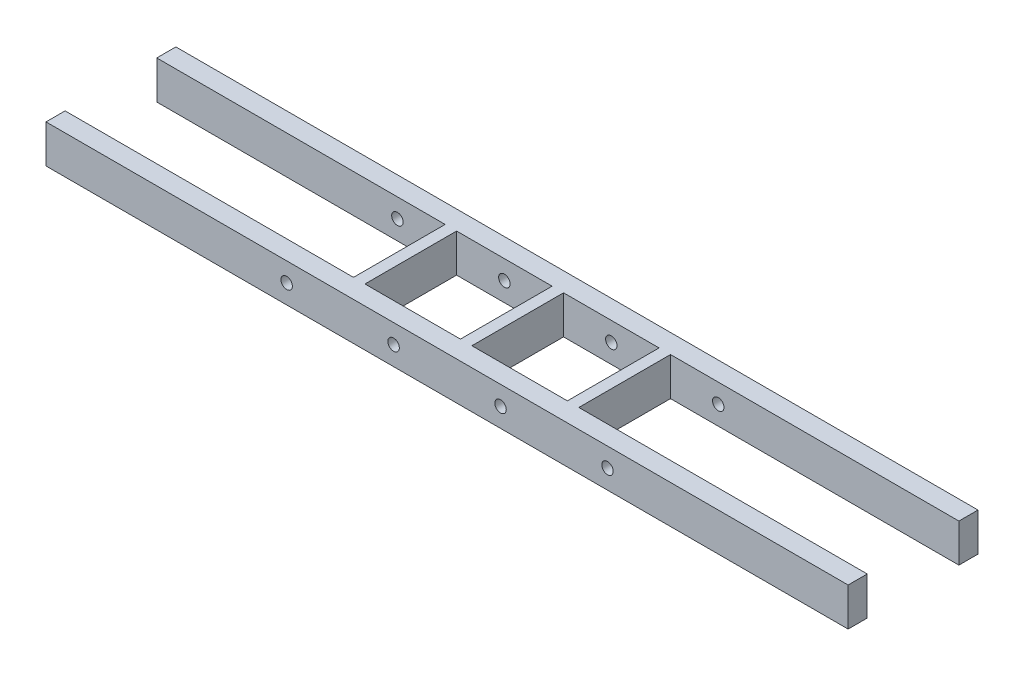
ISO-10303-21;
HEADER;
FILE_DESCRIPTION(('STEP AP214'),'2;1');
FILE_NAME('part.step','',(''),(''),'','','');
FILE_SCHEMA(('AUTOMOTIVE_DESIGN { 1 0 10303 214 1 1 1 1 }'));
ENDSEC;
DATA;
#1=APPLICATION_CONTEXT('core data for automotive mechanical design processes');
#2=APPLICATION_PROTOCOL_DEFINITION('international standard','automotive_design',2000,#1);
#3=PRODUCT_CONTEXT('',#1,'mechanical');
#4=PRODUCT('Part','Part','',(#3));
#5=PRODUCT_RELATED_PRODUCT_CATEGORY('part','',(#4));
#6=PRODUCT_DEFINITION_FORMATION('','',#4);
#7=PRODUCT_DEFINITION_CONTEXT('part definition',#1,'design');
#8=PRODUCT_DEFINITION('design','',#6,#7);
#9=PRODUCT_DEFINITION_SHAPE('','',#8);
#10=(LENGTH_UNIT() NAMED_UNIT(*) SI_UNIT(.MILLI.,.METRE.));
#11=(NAMED_UNIT(*) PLANE_ANGLE_UNIT() SI_UNIT($,.RADIAN.));
#12=(NAMED_UNIT(*) SI_UNIT($,.STERADIAN.) SOLID_ANGLE_UNIT());
#13=UNCERTAINTY_MEASURE_WITH_UNIT(LENGTH_MEASURE(1.E-05),#10,'distance_accuracy_value','');
#14=(GEOMETRIC_REPRESENTATION_CONTEXT(3) GLOBAL_UNCERTAINTY_ASSIGNED_CONTEXT((#13)) GLOBAL_UNIT_ASSIGNED_CONTEXT((#10,
#11,#12)) REPRESENTATION_CONTEXT('',''));
#15=CARTESIAN_POINT('',(0.,0.,0.));
#16=DIRECTION('',(0.,0.,1.));
#17=DIRECTION('',(1.,0.,0.));
#18=AXIS2_PLACEMENT_3D('',#15,#16,#17);
#19=CARTESIAN_POINT('',(0.,0.,5.));
#20=DIRECTION('',(0.,0.,-1.));
#21=DIRECTION('',(-1.,0.,0.));
#22=AXIS2_PLACEMENT_3D('',#19,#20,#21);
#23=PLANE('',#22);
#24=CARTESIAN_POINT('',(42.,0.,5.));
#25=DIRECTION('',(0.,0.,1.));
#26=DIRECTION('',(1.,0.,0.));
#27=AXIS2_PLACEMENT_3D('',#24,#25,#26);
#28=CIRCLE('',#27,1.5);
#29=CARTESIAN_POINT('',(43.5,0.,5.));
#30=VERTEX_POINT('',#29);
#31=EDGE_CURVE('E452',#30,#30,#28,.T.);
#32=ORIENTED_EDGE('',*,*,#31,.F.);
#33=EDGE_LOOP('',(#32));
#34=FACE_BOUND('',#33,.T.);
#35=DIRECTION('',(0.,1.,0.));
#36=VECTOR('',#35,1.);
#37=CARTESIAN_POINT('',(29.5,0.,5.));
#38=LINE('',#37,#36);
#39=CARTESIAN_POINT('',(29.5,-5.,5.));
#40=VERTEX_POINT('',#39);
#41=CARTESIAN_POINT('',(29.5,5.,5.));
#42=VERTEX_POINT('',#41);
#43=EDGE_CURVE('E296',#40,#42,#38,.T.);
#44=ORIENTED_EDGE('',*,*,#43,.F.);
#45=DIRECTION('',(1.,0.,0.));
#46=VECTOR('',#45,1.);
#47=CARTESIAN_POINT('',(-105.,-5.,5.));
#48=LINE('',#47,#46);
#49=CARTESIAN_POINT('',(105.,-5.,5.));
#50=VERTEX_POINT('',#49);
#51=EDGE_CURVE('E488',#40,#50,#48,.T.);
#52=ORIENTED_EDGE('',*,*,#51,.T.);
#53=DIRECTION('',(0.,1.,0.));
#54=VECTOR('',#53,1.);
#55=CARTESIAN_POINT('',(105.,-5.,5.));
#56=LINE('',#55,#54);
#57=CARTESIAN_POINT('',(105.,5.,5.));
#58=VERTEX_POINT('',#57);
#59=EDGE_CURVE('E484',#50,#58,#56,.T.);
#60=ORIENTED_EDGE('',*,*,#59,.T.);
#61=DIRECTION('',(1.,0.,0.));
#62=VECTOR('',#61,1.);
#63=CARTESIAN_POINT('',(-105.,5.,5.));
#64=LINE('',#63,#62);
#65=EDGE_CURVE('E479',#42,#58,#64,.T.);
#66=ORIENTED_EDGE('',*,*,#65,.F.);
#67=EDGE_LOOP('',(#44,#52,#60,#66));
#68=FACE_BOUND('',#67,.T.);
#69=ADVANCED_FACE('F155',(#34,#68),#23,.F.);
#70=CARTESIAN_POINT('',(0.,0.,29.));
#71=DIRECTION('',(0.,0.,-1.));
#72=DIRECTION('',(-1.,0.,0.));
#73=AXIS2_PLACEMENT_3D('',#70,#71,#72);
#74=PLANE('',#73);
#75=CARTESIAN_POINT('',(42.,0.,29.));
#76=DIRECTION('',(0.,0.,1.));
#77=DIRECTION('',(1.,0.,0.));
#78=AXIS2_PLACEMENT_3D('',#75,#76,#77);
#79=CIRCLE('',#78,1.5);
#80=CARTESIAN_POINT('',(43.5,0.,29.));
#81=VERTEX_POINT('',#80);
#82=EDGE_CURVE('E366',#81,#81,#79,.T.);
#83=ORIENTED_EDGE('',*,*,#82,.T.);
#84=EDGE_LOOP('',(#83));
#85=FACE_BOUND('',#84,.T.);
#86=DIRECTION('',(-1.,0.,0.));
#87=VECTOR('',#86,1.);
#88=CARTESIAN_POINT('',(-399918.75,-4.99999999999545,29.));
#89=LINE('',#88,#87);
#90=CARTESIAN_POINT('',(105.000000000018,-4.99999999999545,29.));
#91=VERTEX_POINT('',#90);
#92=CARTESIAN_POINT('',(29.5,-5.,29.));
#93=VERTEX_POINT('',#92);
#94=EDGE_CURVE('E310',#91,#93,#89,.T.);
#95=ORIENTED_EDGE('',*,*,#94,.T.);
#96=DIRECTION('',(0.,-1.,0.));
#97=VECTOR('',#96,1.);
#98=CARTESIAN_POINT('',(29.5,-5.,29.));
#99=LINE('',#98,#97);
#100=CARTESIAN_POINT('',(29.5,5.,29.));
#101=VERTEX_POINT('',#100);
#102=EDGE_CURVE('E293',#101,#93,#99,.T.);
#103=ORIENTED_EDGE('',*,*,#102,.F.);
#104=DIRECTION('',(-1.,0.,0.));
#105=VECTOR('',#104,1.);
#106=CARTESIAN_POINT('',(-399918.75,4.99999999999545,29.));
#107=LINE('',#106,#105);
#108=CARTESIAN_POINT('',(105.000000000018,4.99999999999545,29.));
#109=VERTEX_POINT('',#108);
#110=EDGE_CURVE('E307',#109,#101,#107,.T.);
#111=ORIENTED_EDGE('',*,*,#110,.F.);
#112=DIRECTION('',(0.,-1.,0.));
#113=VECTOR('',#112,1.);
#114=CARTESIAN_POINT('',(105.000000000018,-291594.5,29.));
#115=LINE('',#114,#113);
#116=EDGE_CURVE('E338',#109,#91,#115,.T.);
#117=ORIENTED_EDGE('',*,*,#116,.T.);
#118=EDGE_LOOP('',(#95,#103,#111,#117));
#119=FACE_BOUND('',#118,.T.);
#120=ADVANCED_FACE('F305',(#85,#119),#74,.T.);
#121=CARTESIAN_POINT('',(14.,0.,5.));
#122=DIRECTION('',(0.,0.,1.));
#123=DIRECTION('',(1.,0.,0.));
#124=AXIS2_PLACEMENT_3D('',#121,#122,#123);
#125=CIRCLE('',#124,1.5);
#126=CARTESIAN_POINT('',(15.5,0.,5.));
#127=VERTEX_POINT('',#126);
#128=EDGE_CURVE('E458',#127,#127,#125,.T.);
#129=ORIENTED_EDGE('',*,*,#128,.F.);
#130=EDGE_LOOP('',(#129));
#131=FACE_BOUND('',#130,.T.);
#132=CARTESIAN_POINT('',(1.5,-5.,5.));
#133=VERTEX_POINT('',#132);
#134=CARTESIAN_POINT('',(26.5,-5.,5.));
#135=VERTEX_POINT('',#134);
#136=EDGE_CURVE('E521',#133,#135,#48,.T.);
#137=ORIENTED_EDGE('',*,*,#136,.T.);
#138=DIRECTION('',(0.,1.,0.));
#139=VECTOR('',#138,1.);
#140=CARTESIAN_POINT('',(26.5,0.,5.));
#141=LINE('',#140,#139);
#142=CARTESIAN_POINT('',(26.5,5.,5.));
#143=VERTEX_POINT('',#142);
#144=EDGE_CURVE('E392',#135,#143,#141,.T.);
#145=ORIENTED_EDGE('',*,*,#144,.T.);
#146=CARTESIAN_POINT('',(1.5,5.,5.));
#147=VERTEX_POINT('',#146);
#148=EDGE_CURVE('E539',#147,#143,#64,.T.);
#149=ORIENTED_EDGE('',*,*,#148,.F.);
#150=DIRECTION('',(0.,1.,0.));
#151=VECTOR('',#150,1.);
#152=CARTESIAN_POINT('',(1.5,0.,5.));
#153=LINE('',#152,#151);
#154=EDGE_CURVE('E369',#133,#147,#153,.T.);
#155=ORIENTED_EDGE('',*,*,#154,.F.);
#156=EDGE_LOOP('',(#137,#145,#149,#155));
#157=FACE_BOUND('',#156,.T.);
#158=ADVANCED_FACE('F543',(#131,#157),#23,.F.);
#159=DIRECTION('',(0.,-1.,0.));
#160=VECTOR('',#159,1.);
#161=CARTESIAN_POINT('',(26.5,-5.,29.));
#162=LINE('',#161,#160);
#163=CARTESIAN_POINT('',(26.4999999999986,4.99999999999545,29.));
#164=VERTEX_POINT('',#163);
#165=CARTESIAN_POINT('',(26.5,-5.,29.));
#166=VERTEX_POINT('',#165);
#167=EDGE_CURVE('E172',#164,#166,#162,.T.);
#168=ORIENTED_EDGE('',*,*,#167,.T.);
#169=CARTESIAN_POINT('',(1.50000000002137,-4.99999999999545,29.));
#170=VERTEX_POINT('',#169);
#171=EDGE_CURVE('E334',#166,#170,#89,.T.);
#172=ORIENTED_EDGE('',*,*,#171,.T.);
#173=DIRECTION('',(0.,-1.,0.));
#174=VECTOR('',#173,1.);
#175=CARTESIAN_POINT('',(1.5,-5.,29.));
#176=LINE('',#175,#174);
#177=CARTESIAN_POINT('',(1.50000000002137,4.99999999999545,29.));
#178=VERTEX_POINT('',#177);
#179=EDGE_CURVE('E377',#178,#170,#176,.T.);
#180=ORIENTED_EDGE('',*,*,#179,.F.);
#181=EDGE_CURVE('E317',#164,#178,#107,.T.);
#182=ORIENTED_EDGE('',*,*,#181,.F.);
#183=EDGE_LOOP('',(#168,#172,#180,#182));
#184=FACE_BOUND('',#183,.T.);
#185=CARTESIAN_POINT('',(14.,0.,29.));
#186=DIRECTION('',(0.,0.,1.));
#187=DIRECTION('',(1.,0.,0.));
#188=AXIS2_PLACEMENT_3D('',#185,#186,#187);
#189=CIRCLE('',#188,1.5);
#190=CARTESIAN_POINT('',(15.5,0.,29.));
#191=VERTEX_POINT('',#190);
#192=EDGE_CURVE('E348',#191,#191,#189,.T.);
#193=ORIENTED_EDGE('',*,*,#192,.T.);
#194=EDGE_LOOP('',(#193));
#195=FACE_BOUND('',#194,.T.);
#196=ADVANCED_FACE('F402',(#184,#195),#74,.T.);
#197=CARTESIAN_POINT('',(-14.,0.,5.));
#198=DIRECTION('',(0.,0.,1.));
#199=DIRECTION('',(1.,0.,0.));
#200=AXIS2_PLACEMENT_3D('',#197,#198,#199);
#201=CIRCLE('',#200,1.5);
#202=CARTESIAN_POINT('',(-12.5,0.,5.));
#203=VERTEX_POINT('',#202);
#204=EDGE_CURVE('E464',#203,#203,#201,.T.);
#205=ORIENTED_EDGE('',*,*,#204,.F.);
#206=EDGE_LOOP('',(#205));
#207=FACE_BOUND('',#206,.T.);
#208=CARTESIAN_POINT('',(-26.5,-5.,5.));
#209=VERTEX_POINT('',#208);
#210=CARTESIAN_POINT('',(-1.5,-5.,5.));
#211=VERTEX_POINT('',#210);
#212=EDGE_CURVE('E492',#209,#211,#48,.T.);
#213=ORIENTED_EDGE('',*,*,#212,.T.);
#214=DIRECTION('',(0.,1.,0.));
#215=VECTOR('',#214,1.);
#216=CARTESIAN_POINT('',(-1.5,0.,5.));
#217=LINE('',#216,#215);
#218=CARTESIAN_POINT('',(-1.5,5.,5.));
#219=VERTEX_POINT('',#218);
#220=EDGE_CURVE('E373',#211,#219,#217,.T.);
#221=ORIENTED_EDGE('',*,*,#220,.T.);
#222=CARTESIAN_POINT('',(-26.5,5.,5.));
#223=VERTEX_POINT('',#222);
#224=EDGE_CURVE('E485',#223,#219,#64,.T.);
#225=ORIENTED_EDGE('',*,*,#224,.F.);
#226=DIRECTION('',(0.,1.,0.));
#227=VECTOR('',#226,1.);
#228=CARTESIAN_POINT('',(-26.5,0.,5.));
#229=LINE('',#228,#227);
#230=EDGE_CURVE('E449',#209,#223,#229,.T.);
#231=ORIENTED_EDGE('',*,*,#230,.F.);
#232=EDGE_LOOP('',(#213,#221,#225,#231));
#233=FACE_BOUND('',#232,.T.);
#234=ADVANCED_FACE('F528',(#207,#233),#23,.F.);
#235=CARTESIAN_POINT('',(-105.,-5.,5.));
#236=VERTEX_POINT('',#235);
#237=CARTESIAN_POINT('',(-29.5,-5.,5.));
#238=VERTEX_POINT('',#237);
#239=EDGE_CURVE('E489',#236,#238,#48,.T.);
#240=ORIENTED_EDGE('',*,*,#239,.T.);
#241=DIRECTION('',(0.,1.,0.));
#242=VECTOR('',#241,1.);
#243=CARTESIAN_POINT('',(-29.5,0.,5.));
#244=LINE('',#243,#242);
#245=CARTESIAN_POINT('',(-29.5,5.,5.));
#246=VERTEX_POINT('',#245);
#247=EDGE_CURVE('E446',#238,#246,#244,.T.);
#248=ORIENTED_EDGE('',*,*,#247,.T.);
#249=CARTESIAN_POINT('',(-105.,5.,5.));
#250=VERTEX_POINT('',#249);
#251=EDGE_CURVE('E481',#250,#246,#64,.T.);
#252=ORIENTED_EDGE('',*,*,#251,.F.);
#253=DIRECTION('',(0.,1.,0.));
#254=VECTOR('',#253,1.);
#255=CARTESIAN_POINT('',(-105.,-5.,5.));
#256=LINE('',#255,#254);
#257=EDGE_CURVE('E476',#236,#250,#256,.T.);
#258=ORIENTED_EDGE('',*,*,#257,.F.);
#259=EDGE_LOOP('',(#240,#248,#252,#258));
#260=FACE_BOUND('',#259,.T.);
#261=CARTESIAN_POINT('',(-42.,0.,5.));
#262=DIRECTION('',(0.,0.,1.));
#263=DIRECTION('',(1.,0.,0.));
#264=AXIS2_PLACEMENT_3D('',#261,#262,#263);
#265=CIRCLE('',#264,1.5);
#266=CARTESIAN_POINT('',(-40.5,0.,5.));
#267=VERTEX_POINT('',#266);
#268=EDGE_CURVE('E470',#267,#267,#265,.T.);
#269=ORIENTED_EDGE('',*,*,#268,.F.);
#270=EDGE_LOOP('',(#269));
#271=FACE_BOUND('',#270,.T.);
#272=ADVANCED_FACE('F555',(#260,#271),#23,.F.);
#273=CARTESIAN_POINT('',(0.,0.,0.));
#274=DIRECTION('',(0.,0.,-1.));
#275=DIRECTION('',(-1.,0.,0.));
#276=AXIS2_PLACEMENT_3D('',#273,#274,#275);
#277=PLANE('',#276);
#278=DIRECTION('',(1.,0.,0.));
#279=VECTOR('',#278,1.);
#280=CARTESIAN_POINT('',(-105.,5.,0.));
#281=LINE('',#280,#279);
#282=CARTESIAN_POINT('',(-105.,5.,0.));
#283=VERTEX_POINT('',#282);
#284=CARTESIAN_POINT('',(105.,5.,0.));
#285=VERTEX_POINT('',#284);
#286=EDGE_CURVE('E495',#283,#285,#281,.T.);
#287=ORIENTED_EDGE('',*,*,#286,.T.);
#288=DIRECTION('',(0.,1.,0.));
#289=VECTOR('',#288,1.);
#290=CARTESIAN_POINT('',(105.,-5.,0.));
#291=LINE('',#290,#289);
#292=CARTESIAN_POINT('',(105.,-5.,0.));
#293=VERTEX_POINT('',#292);
#294=EDGE_CURVE('E497',#293,#285,#291,.T.);
#295=ORIENTED_EDGE('',*,*,#294,.F.);
#296=DIRECTION('',(1.,0.,0.));
#297=VECTOR('',#296,1.);
#298=CARTESIAN_POINT('',(-105.,-5.,0.));
#299=LINE('',#298,#297);
#300=CARTESIAN_POINT('',(-105.,-5.,0.));
#301=VERTEX_POINT('',#300);
#302=EDGE_CURVE('E480',#301,#293,#299,.T.);
#303=ORIENTED_EDGE('',*,*,#302,.F.);
#304=DIRECTION('',(0.,1.,0.));
#305=VECTOR('',#304,1.);
#306=CARTESIAN_POINT('',(-105.,-5.,0.));
#307=LINE('',#306,#305);
#308=EDGE_CURVE('E473',#301,#283,#307,.T.);
#309=ORIENTED_EDGE('',*,*,#308,.T.);
#310=EDGE_LOOP('',(#287,#295,#303,#309));
#311=FACE_BOUND('',#310,.T.);
#312=CARTESIAN_POINT('',(-42.,0.,0.));
#313=DIRECTION('',(0.,0.,1.));
#314=DIRECTION('',(1.,0.,0.));
#315=AXIS2_PLACEMENT_3D('',#312,#313,#314);
#316=CIRCLE('',#315,1.5);
#317=CARTESIAN_POINT('',(-40.5,0.,0.));
#318=VERTEX_POINT('',#317);
#319=EDGE_CURVE('E467',#318,#318,#316,.T.);
#320=ORIENTED_EDGE('',*,*,#319,.T.);
#321=EDGE_LOOP('',(#320));
#322=FACE_BOUND('',#321,.T.);
#323=CARTESIAN_POINT('',(-14.,0.,0.));
#324=DIRECTION('',(0.,0.,1.));
#325=DIRECTION('',(1.,0.,0.));
#326=AXIS2_PLACEMENT_3D('',#323,#324,#325);
#327=CIRCLE('',#326,1.5);
#328=CARTESIAN_POINT('',(-12.5,0.,0.));
#329=VERTEX_POINT('',#328);
#330=EDGE_CURVE('E461',#329,#329,#327,.T.);
#331=ORIENTED_EDGE('',*,*,#330,.T.);
#332=EDGE_LOOP('',(#331));
#333=FACE_BOUND('',#332,.T.);
#334=CARTESIAN_POINT('',(14.,0.,0.));
#335=DIRECTION('',(0.,0.,1.));
#336=DIRECTION('',(1.,0.,0.));
#337=AXIS2_PLACEMENT_3D('',#334,#335,#336);
#338=CIRCLE('',#337,1.5);
#339=CARTESIAN_POINT('',(15.5,0.,0.));
#340=VERTEX_POINT('',#339);
#341=EDGE_CURVE('E455',#340,#340,#338,.T.);
#342=ORIENTED_EDGE('',*,*,#341,.T.);
#343=EDGE_LOOP('',(#342));
#344=FACE_BOUND('',#343,.T.);
#345=CARTESIAN_POINT('',(42.,0.,0.));
#346=DIRECTION('',(0.,0.,1.));
#347=DIRECTION('',(1.,0.,0.));
#348=AXIS2_PLACEMENT_3D('',#345,#346,#347);
#349=CIRCLE('',#348,1.5);
#350=CARTESIAN_POINT('',(43.5,0.,0.));
#351=VERTEX_POINT('',#350);
#352=EDGE_CURVE('E451',#351,#351,#349,.T.);
#353=ORIENTED_EDGE('',*,*,#352,.T.);
#354=EDGE_LOOP('',(#353));
#355=FACE_BOUND('',#354,.T.);
#356=ADVANCED_FACE('F513',(#311,#322,#333,#344,#355),#277,.T.);
#357=CARTESIAN_POINT('',(-105.,-5.,5.));
#358=DIRECTION('',(-1.,0.,0.));
#359=DIRECTION('',(0.,0.,1.));
#360=AXIS2_PLACEMENT_3D('',#357,#358,#359);
#361=PLANE('',#360);
#362=ORIENTED_EDGE('',*,*,#308,.F.);
#363=DIRECTION('',(0.,0.,-1.));
#364=VECTOR('',#363,1.);
#365=CARTESIAN_POINT('',(-105.,-5.,5.));
#366=LINE('',#365,#364);
#367=EDGE_CURVE('E12',#236,#301,#366,.T.);
#368=ORIENTED_EDGE('',*,*,#367,.F.);
#369=ORIENTED_EDGE('',*,*,#257,.T.);
#370=DIRECTION('',(0.,0.,-1.));
#371=VECTOR('',#370,1.);
#372=CARTESIAN_POINT('',(-105.,5.,5.));
#373=LINE('',#372,#371);
#374=EDGE_CURVE('E159',#250,#283,#373,.T.);
#375=ORIENTED_EDGE('',*,*,#374,.T.);
#376=EDGE_LOOP('',(#362,#368,#369,#375));
#377=FACE_BOUND('',#376,.T.);
#378=ADVANCED_FACE('F157',(#377),#361,.T.);
#379=CARTESIAN_POINT('',(-105.,-5.,5.));
#380=DIRECTION('',(0.,1.,0.));
#381=DIRECTION('',(0.,0.,1.));
#382=AXIS2_PLACEMENT_3D('',#379,#380,#381);
#383=PLANE('',#382);
#384=ORIENTED_EDGE('',*,*,#51,.F.);
#385=DIRECTION('',(0.,0.,-1.));
#386=VECTOR('',#385,1.);
#387=CARTESIAN_POINT('',(29.5,-5.,39.4403065089106));
#388=LINE('',#387,#386);
#389=EDGE_CURVE('E300',#93,#40,#388,.T.);
#390=ORIENTED_EDGE('',*,*,#389,.F.);
#391=ORIENTED_EDGE('',*,*,#94,.F.);
#392=DIRECTION('',(0.,0.,-1.));
#393=VECTOR('',#392,1.);
#394=CARTESIAN_POINT('',(105.000000000018,-4.99999999999545,34.));
#395=LINE('',#394,#393);
#396=CARTESIAN_POINT('',(105.000000000018,-4.99999999999545,34.));
#397=VERTEX_POINT('',#396);
#398=EDGE_CURVE('E343',#397,#91,#395,.T.);
#399=ORIENTED_EDGE('',*,*,#398,.F.);
#400=DIRECTION('',(-1.,0.,0.));
#401=VECTOR('',#400,1.);
#402=CARTESIAN_POINT('',(-399918.75,-4.99999999999545,34.));
#403=LINE('',#402,#401);
#404=CARTESIAN_POINT('',(-105.000000000018,-4.99999999999545,34.));
#405=VERTEX_POINT('',#404);
#406=EDGE_CURVE('E321',#397,#405,#403,.T.);
#407=ORIENTED_EDGE('',*,*,#406,.T.);
#408=DIRECTION('',(0.,0.,-1.));
#409=VECTOR('',#408,1.);
#410=CARTESIAN_POINT('',(-105.000000000018,-4.99999999999545,34.));
#411=LINE('',#410,#409);
#412=CARTESIAN_POINT('',(-105.000000000018,-4.99999999999545,29.));
#413=VERTEX_POINT('',#412);
#414=EDGE_CURVE('E425',#405,#413,#411,.T.);
#415=ORIENTED_EDGE('',*,*,#414,.T.);
#416=CARTESIAN_POINT('',(-29.4999999999845,-4.99999999999545,29.));
#417=VERTEX_POINT('',#416);
#418=EDGE_CURVE('E336',#417,#413,#89,.T.);
#419=ORIENTED_EDGE('',*,*,#418,.F.);
#420=DIRECTION('',(0.,0.,-1.));
#421=VECTOR('',#420,1.);
#422=CARTESIAN_POINT('',(-29.5,-5.,39.4403065089106));
#423=LINE('',#422,#421);
#424=EDGE_CURVE('E437',#417,#238,#423,.T.);
#425=ORIENTED_EDGE('',*,*,#424,.T.);
#426=ORIENTED_EDGE('',*,*,#239,.F.);
#427=ORIENTED_EDGE('',*,*,#367,.T.);
#428=ORIENTED_EDGE('',*,*,#302,.T.);
#429=DIRECTION('',(0.,0.,-1.));
#430=VECTOR('',#429,1.);
#431=CARTESIAN_POINT('',(105.,-5.,5.));
#432=LINE('',#431,#430);
#433=EDGE_CURVE('E164',#50,#293,#432,.T.);
#434=ORIENTED_EDGE('',*,*,#433,.F.);
#435=EDGE_LOOP('',(#384,#390,#391,#399,#407,#415,#419,#425,#426,#427,#428,#434));
#436=FACE_BOUND('',#435,.T.);
#437=DIRECTION('',(0.,0.,-1.));
#438=VECTOR('',#437,1.);
#439=CARTESIAN_POINT('',(26.5,-5.,39.4403065089106));
#440=LINE('',#439,#438);
#441=EDGE_CURVE('E393',#166,#135,#440,.T.);
#442=ORIENTED_EDGE('',*,*,#441,.T.);
#443=ORIENTED_EDGE('',*,*,#136,.F.);
#444=DIRECTION('',(0.,0.,-1.));
#445=VECTOR('',#444,1.);
#446=CARTESIAN_POINT('',(1.5,-5.,39.4403065089106));
#447=LINE('',#446,#445);
#448=EDGE_CURVE('E380',#170,#133,#447,.T.);
#449=ORIENTED_EDGE('',*,*,#448,.F.);
#450=ORIENTED_EDGE('',*,*,#171,.F.);
#451=EDGE_LOOP('',(#442,#443,#449,#450));
#452=FACE_BOUND('',#451,.T.);
#453=DIRECTION('',(0.,0.,-1.));
#454=VECTOR('',#453,1.);
#455=CARTESIAN_POINT('',(-1.5,-5.,39.4403065089106));
#456=LINE('',#455,#454);
#457=CARTESIAN_POINT('',(-1.50000000002137,-4.99999999999545,29.));
#458=VERTEX_POINT('',#457);
#459=EDGE_CURVE('E376',#458,#211,#456,.T.);
#460=ORIENTED_EDGE('',*,*,#459,.T.);
#461=ORIENTED_EDGE('',*,*,#212,.F.);
#462=DIRECTION('',(0.,0.,-1.));
#463=VECTOR('',#462,1.);
#464=CARTESIAN_POINT('',(-26.5,-5.,39.4403065089106));
#465=LINE('',#464,#463);
#466=CARTESIAN_POINT('',(-26.5,-5.,29.));
#467=VERTEX_POINT('',#466);
#468=EDGE_CURVE('E436',#467,#209,#465,.T.);
#469=ORIENTED_EDGE('',*,*,#468,.F.);
#470=EDGE_CURVE('E411',#458,#467,#89,.T.);
#471=ORIENTED_EDGE('',*,*,#470,.F.);
#472=EDGE_LOOP('',(#460,#461,#469,#471));
#473=FACE_BOUND('',#472,.T.);
#474=ADVANCED_FACE('F407',(#436,#452,#473),#383,.F.);
#475=CARTESIAN_POINT('',(105.,-5.,5.));
#476=DIRECTION('',(-1.,0.,0.));
#477=DIRECTION('',(0.,0.,1.));
#478=AXIS2_PLACEMENT_3D('',#475,#476,#477);
#479=PLANE('',#478);
#480=ORIENTED_EDGE('',*,*,#294,.T.);
#481=DIRECTION('',(0.,0.,-1.));
#482=VECTOR('',#481,1.);
#483=CARTESIAN_POINT('',(105.,5.,5.));
#484=LINE('',#483,#482);
#485=EDGE_CURVE('E502',#58,#285,#484,.T.);
#486=ORIENTED_EDGE('',*,*,#485,.F.);
#487=ORIENTED_EDGE('',*,*,#59,.F.);
#488=ORIENTED_EDGE('',*,*,#433,.T.);
#489=EDGE_LOOP('',(#480,#486,#487,#488));
#490=FACE_BOUND('',#489,.T.);
#491=ADVANCED_FACE('F519',(#490),#479,.F.);
#492=CARTESIAN_POINT('',(-105.,5.,5.));
#493=DIRECTION('',(0.,1.,0.));
#494=DIRECTION('',(0.,0.,1.));
#495=AXIS2_PLACEMENT_3D('',#492,#493,#494);
#496=PLANE('',#495);
#497=DIRECTION('',(0.,0.,-1.));
#498=VECTOR('',#497,1.);
#499=CARTESIAN_POINT('',(29.5,5.,39.4403065089106));
#500=LINE('',#499,#498);
#501=EDGE_CURVE('E290',#101,#42,#500,.T.);
#502=ORIENTED_EDGE('',*,*,#501,.T.);
#503=ORIENTED_EDGE('',*,*,#65,.T.);
#504=ORIENTED_EDGE('',*,*,#485,.T.);
#505=ORIENTED_EDGE('',*,*,#286,.F.);
#506=ORIENTED_EDGE('',*,*,#374,.F.);
#507=ORIENTED_EDGE('',*,*,#251,.T.);
#508=DIRECTION('',(0.,0.,-1.));
#509=VECTOR('',#508,1.);
#510=CARTESIAN_POINT('',(-29.5,5.,39.4403065089106));
#511=LINE('',#510,#509);
#512=CARTESIAN_POINT('',(-29.5,5.,29.));
#513=VERTEX_POINT('',#512);
#514=EDGE_CURVE('E439',#513,#246,#511,.T.);
#515=ORIENTED_EDGE('',*,*,#514,.F.);
#516=CARTESIAN_POINT('',(-105.000000000018,4.99999999999545,29.));
#517=VERTEX_POINT('',#516);
#518=EDGE_CURVE('E319',#513,#517,#107,.T.);
#519=ORIENTED_EDGE('',*,*,#518,.T.);
#520=DIRECTION('',(0.,0.,-1.));
#521=VECTOR('',#520,1.);
#522=CARTESIAN_POINT('',(-105.000000000018,4.99999999999545,34.));
#523=LINE('',#522,#521);
#524=CARTESIAN_POINT('',(-105.000000000018,4.99999999999545,34.));
#525=VERTEX_POINT('',#524);
#526=EDGE_CURVE('E429',#525,#517,#523,.T.);
#527=ORIENTED_EDGE('',*,*,#526,.F.);
#528=DIRECTION('',(-1.,0.,0.));
#529=VECTOR('',#528,1.);
#530=CARTESIAN_POINT('',(-399918.75,4.99999999999545,34.));
#531=LINE('',#530,#529);
#532=CARTESIAN_POINT('',(105.000000000018,4.99999999999545,34.));
#533=VERTEX_POINT('',#532);
#534=EDGE_CURVE('E341',#533,#525,#531,.T.);
#535=ORIENTED_EDGE('',*,*,#534,.F.);
#536=DIRECTION('',(0.,0.,-1.));
#537=VECTOR('',#536,1.);
#538=CARTESIAN_POINT('',(105.000000000018,4.99999999999545,34.));
#539=LINE('',#538,#537);
#540=EDGE_CURVE('E315',#533,#109,#539,.T.);
#541=ORIENTED_EDGE('',*,*,#540,.T.);
#542=ORIENTED_EDGE('',*,*,#110,.T.);
#543=EDGE_LOOP('',(#502,#503,#504,#505,#506,#507,#515,#519,#527,#535,#541,#542));
#544=FACE_BOUND('',#543,.T.);
#545=ORIENTED_EDGE('',*,*,#148,.T.);
#546=DIRECTION('',(0.,0.,-1.));
#547=VECTOR('',#546,1.);
#548=CARTESIAN_POINT('',(26.5,5.,39.4403065089106));
#549=LINE('',#548,#547);
#550=EDGE_CURVE('E176',#164,#143,#549,.T.);
#551=ORIENTED_EDGE('',*,*,#550,.F.);
#552=ORIENTED_EDGE('',*,*,#181,.T.);
#553=DIRECTION('',(0.,0.,-1.));
#554=VECTOR('',#553,1.);
#555=CARTESIAN_POINT('',(1.5,5.,39.4403065089106));
#556=LINE('',#555,#554);
#557=EDGE_CURVE('E386',#178,#147,#556,.T.);
#558=ORIENTED_EDGE('',*,*,#557,.T.);
#559=EDGE_LOOP('',(#545,#551,#552,#558));
#560=FACE_BOUND('',#559,.T.);
#561=ORIENTED_EDGE('',*,*,#224,.T.);
#562=DIRECTION('',(0.,0.,-1.));
#563=VECTOR('',#562,1.);
#564=CARTESIAN_POINT('',(-1.5,5.,39.4403065089106));
#565=LINE('',#564,#563);
#566=CARTESIAN_POINT('',(-1.5,5.,29.));
#567=VERTEX_POINT('',#566);
#568=EDGE_CURVE('E384',#567,#219,#565,.T.);
#569=ORIENTED_EDGE('',*,*,#568,.F.);
#570=CARTESIAN_POINT('',(-26.5,5.,29.));
#571=VERTEX_POINT('',#570);
#572=EDGE_CURVE('E323',#567,#571,#107,.T.);
#573=ORIENTED_EDGE('',*,*,#572,.T.);
#574=DIRECTION('',(0.,0.,-1.));
#575=VECTOR('',#574,1.);
#576=CARTESIAN_POINT('',(-26.5,5.,39.4403065089106));
#577=LINE('',#576,#575);
#578=EDGE_CURVE('E441',#571,#223,#577,.T.);
#579=ORIENTED_EDGE('',*,*,#578,.T.);
#580=EDGE_LOOP('',(#561,#569,#573,#579));
#581=FACE_BOUND('',#580,.T.);
#582=ADVANCED_FACE('F312',(#544,#560,#581),#496,.T.);
#583=CARTESIAN_POINT('',(-42.,0.,5.));
#584=DIRECTION('',(0.,0.,-1.));
#585=DIRECTION('',(-1.,0.,0.));
#586=AXIS2_PLACEMENT_3D('',#583,#584,#585);
#587=CYLINDRICAL_SURFACE('',#586,1.5);
#588=ORIENTED_EDGE('',*,*,#268,.T.);
#589=EDGE_LOOP('',(#588));
#590=FACE_BOUND('',#589,.T.);
#591=ORIENTED_EDGE('',*,*,#319,.F.);
#592=EDGE_LOOP('',(#591));
#593=FACE_BOUND('',#592,.T.);
#594=ADVANCED_FACE('F576',(#590,#593),#587,.F.);
#595=CARTESIAN_POINT('',(-14.,0.,5.));
#596=DIRECTION('',(0.,0.,-1.));
#597=DIRECTION('',(-1.,0.,0.));
#598=AXIS2_PLACEMENT_3D('',#595,#596,#597);
#599=CYLINDRICAL_SURFACE('',#598,1.5);
#600=ORIENTED_EDGE('',*,*,#204,.T.);
#601=EDGE_LOOP('',(#600));
#602=FACE_BOUND('',#601,.T.);
#603=ORIENTED_EDGE('',*,*,#330,.F.);
#604=EDGE_LOOP('',(#603));
#605=FACE_BOUND('',#604,.T.);
#606=ADVANCED_FACE('F579',(#602,#605),#599,.F.);
#607=CARTESIAN_POINT('',(14.,0.,5.));
#608=DIRECTION('',(0.,0.,-1.));
#609=DIRECTION('',(-1.,0.,0.));
#610=AXIS2_PLACEMENT_3D('',#607,#608,#609);
#611=CYLINDRICAL_SURFACE('',#610,1.5);
#612=ORIENTED_EDGE('',*,*,#128,.T.);
#613=EDGE_LOOP('',(#612));
#614=FACE_BOUND('',#613,.T.);
#615=ORIENTED_EDGE('',*,*,#341,.F.);
#616=EDGE_LOOP('',(#615));
#617=FACE_BOUND('',#616,.T.);
#618=ADVANCED_FACE('F591',(#614,#617),#611,.F.);
#619=CARTESIAN_POINT('',(42.,0.,5.));
#620=DIRECTION('',(0.,0.,-1.));
#621=DIRECTION('',(-1.,0.,0.));
#622=AXIS2_PLACEMENT_3D('',#619,#620,#621);
#623=CYLINDRICAL_SURFACE('',#622,1.5);
#624=ORIENTED_EDGE('',*,*,#31,.T.);
#625=EDGE_LOOP('',(#624));
#626=FACE_BOUND('',#625,.T.);
#627=ORIENTED_EDGE('',*,*,#352,.F.);
#628=EDGE_LOOP('',(#627));
#629=FACE_BOUND('',#628,.T.);
#630=ADVANCED_FACE('F588',(#626,#629),#623,.F.);
#631=CARTESIAN_POINT('',(-26.5,-5.,39.4403065089106));
#632=DIRECTION('',(-1.,0.,0.));
#633=DIRECTION('',(0.,0.,1.));
#634=AXIS2_PLACEMENT_3D('',#631,#632,#633);
#635=PLANE('',#634);
#636=ORIENTED_EDGE('',*,*,#468,.T.);
#637=ORIENTED_EDGE('',*,*,#230,.T.);
#638=ORIENTED_EDGE('',*,*,#578,.F.);
#639=DIRECTION('',(0.,-1.,0.));
#640=VECTOR('',#639,1.);
#641=CARTESIAN_POINT('',(-26.5,-5.,29.));
#642=LINE('',#641,#640);
#643=EDGE_CURVE('E434',#571,#467,#642,.T.);
#644=ORIENTED_EDGE('',*,*,#643,.T.);
#645=EDGE_LOOP('',(#636,#637,#638,#644));
#646=FACE_BOUND('',#645,.T.);
#647=ADVANCED_FACE('F590',(#646),#635,.F.);
#648=CARTESIAN_POINT('',(-29.5,-5.,39.4403065089106));
#649=DIRECTION('',(-1.,0.,0.));
#650=DIRECTION('',(0.,0.,1.));
#651=AXIS2_PLACEMENT_3D('',#648,#649,#650);
#652=PLANE('',#651);
#653=ORIENTED_EDGE('',*,*,#247,.F.);
#654=ORIENTED_EDGE('',*,*,#424,.F.);
#655=DIRECTION('',(0.,-1.,0.));
#656=VECTOR('',#655,1.);
#657=CARTESIAN_POINT('',(-29.5,-5.,29.));
#658=LINE('',#657,#656);
#659=EDGE_CURVE('E422',#513,#417,#658,.T.);
#660=ORIENTED_EDGE('',*,*,#659,.F.);
#661=ORIENTED_EDGE('',*,*,#514,.T.);
#662=EDGE_LOOP('',(#653,#654,#660,#661));
#663=FACE_BOUND('',#662,.T.);
#664=ADVANCED_FACE('F598',(#663),#652,.T.);
#665=DIRECTION('',(0.,-1.,0.));
#666=VECTOR('',#665,1.);
#667=CARTESIAN_POINT('',(-1.5,-5.,29.));
#668=LINE('',#667,#666);
#669=EDGE_CURVE('E381',#567,#458,#668,.T.);
#670=ORIENTED_EDGE('',*,*,#669,.T.);
#671=ORIENTED_EDGE('',*,*,#470,.T.);
#672=ORIENTED_EDGE('',*,*,#643,.F.);
#673=ORIENTED_EDGE('',*,*,#572,.F.);
#674=EDGE_LOOP('',(#670,#671,#672,#673));
#675=FACE_BOUND('',#674,.T.);
#676=CARTESIAN_POINT('',(-14.,0.,29.));
#677=DIRECTION('',(0.,0.,1.));
#678=DIRECTION('',(1.,0.,0.));
#679=AXIS2_PLACEMENT_3D('',#676,#677,#678);
#680=CIRCLE('',#679,1.5);
#681=CARTESIAN_POINT('',(-12.5,0.,29.));
#682=VERTEX_POINT('',#681);
#683=EDGE_CURVE('E354',#682,#682,#680,.T.);
#684=ORIENTED_EDGE('',*,*,#683,.T.);
#685=EDGE_LOOP('',(#684));
#686=FACE_BOUND('',#685,.T.);
#687=ADVANCED_FACE('F649',(#675,#686),#74,.T.);
#688=CARTESIAN_POINT('',(0.,0.,34.));
#689=DIRECTION('',(0.,0.,-1.));
#690=DIRECTION('',(-1.,0.,0.));
#691=AXIS2_PLACEMENT_3D('',#688,#689,#690);
#692=PLANE('',#691);
#693=DIRECTION('',(0.,-1.,0.));
#694=VECTOR('',#693,1.);
#695=CARTESIAN_POINT('',(105.000000000018,-291594.5,34.));
#696=LINE('',#695,#694);
#697=EDGE_CURVE('E316',#533,#397,#696,.T.);
#698=ORIENTED_EDGE('',*,*,#697,.F.);
#699=ORIENTED_EDGE('',*,*,#534,.T.);
#700=DIRECTION('',(0.,-1.,0.));
#701=VECTOR('',#700,1.);
#702=CARTESIAN_POINT('',(-105.000000000018,-291594.5,34.));
#703=LINE('',#702,#701);
#704=EDGE_CURVE('E344',#525,#405,#703,.T.);
#705=ORIENTED_EDGE('',*,*,#704,.T.);
#706=ORIENTED_EDGE('',*,*,#406,.F.);
#707=EDGE_LOOP('',(#698,#699,#705,#706));
#708=FACE_BOUND('',#707,.T.);
#709=CARTESIAN_POINT('',(14.,0.,34.));
#710=DIRECTION('',(0.,0.,1.));
#711=DIRECTION('',(1.,0.,0.));
#712=AXIS2_PLACEMENT_3D('',#709,#710,#711);
#713=CIRCLE('',#712,1.5);
#714=CARTESIAN_POINT('',(15.5,0.,34.));
#715=VERTEX_POINT('',#714);
#716=EDGE_CURVE('E340',#715,#715,#713,.T.);
#717=ORIENTED_EDGE('',*,*,#716,.F.);
#718=EDGE_LOOP('',(#717));
#719=FACE_BOUND('',#718,.T.);
#720=CARTESIAN_POINT('',(-14.,0.,34.));
#721=DIRECTION('',(0.,0.,1.));
#722=DIRECTION('',(1.,0.,0.));
#723=AXIS2_PLACEMENT_3D('',#720,#721,#722);
#724=CIRCLE('',#723,1.5);
#725=CARTESIAN_POINT('',(-12.5,0.,34.));
#726=VERTEX_POINT('',#725);
#727=EDGE_CURVE('E351',#726,#726,#724,.T.);
#728=ORIENTED_EDGE('',*,*,#727,.F.);
#729=EDGE_LOOP('',(#728));
#730=FACE_BOUND('',#729,.T.);
#731=CARTESIAN_POINT('',(-42.,0.,34.));
#732=DIRECTION('',(0.,0.,1.));
#733=DIRECTION('',(1.,0.,0.));
#734=AXIS2_PLACEMENT_3D('',#731,#732,#733);
#735=CIRCLE('',#734,1.5);
#736=CARTESIAN_POINT('',(-40.5,0.,34.));
#737=VERTEX_POINT('',#736);
#738=EDGE_CURVE('E357',#737,#737,#735,.T.);
#739=ORIENTED_EDGE('',*,*,#738,.F.);
#740=EDGE_LOOP('',(#739));
#741=FACE_BOUND('',#740,.T.);
#742=CARTESIAN_POINT('',(42.,0.,34.));
#743=DIRECTION('',(0.,0.,1.));
#744=DIRECTION('',(1.,0.,0.));
#745=AXIS2_PLACEMENT_3D('',#742,#743,#744);
#746=CIRCLE('',#745,1.5);
#747=CARTESIAN_POINT('',(43.5,0.,34.));
#748=VERTEX_POINT('',#747);
#749=EDGE_CURVE('E363',#748,#748,#746,.T.);
#750=ORIENTED_EDGE('',*,*,#749,.F.);
#751=EDGE_LOOP('',(#750));
#752=FACE_BOUND('',#751,.T.);
#753=ADVANCED_FACE('F708',(#708,#719,#730,#741,#752),#692,.F.);
#754=CARTESIAN_POINT('',(-42.,0.,29.));
#755=DIRECTION('',(0.,0.,1.));
#756=DIRECTION('',(1.,0.,0.));
#757=AXIS2_PLACEMENT_3D('',#754,#755,#756);
#758=CIRCLE('',#757,1.5);
#759=CARTESIAN_POINT('',(-40.5,0.,29.));
#760=VERTEX_POINT('',#759);
#761=EDGE_CURVE('E360',#760,#760,#758,.T.);
#762=ORIENTED_EDGE('',*,*,#761,.T.);
#763=EDGE_LOOP('',(#762));
#764=FACE_BOUND('',#763,.T.);
#765=ORIENTED_EDGE('',*,*,#518,.F.);
#766=ORIENTED_EDGE('',*,*,#659,.T.);
#767=ORIENTED_EDGE('',*,*,#418,.T.);
#768=DIRECTION('',(0.,-1.,0.));
#769=VECTOR('',#768,1.);
#770=CARTESIAN_POINT('',(-105.000000000018,-291594.5,29.));
#771=LINE('',#770,#769);
#772=EDGE_CURVE('E326',#517,#413,#771,.T.);
#773=ORIENTED_EDGE('',*,*,#772,.F.);
#774=EDGE_LOOP('',(#765,#766,#767,#773));
#775=FACE_BOUND('',#774,.T.);
#776=ADVANCED_FACE('F420',(#764,#775),#74,.T.);
#777=CARTESIAN_POINT('',(105.000000000018,-291594.5,34.));
#778=DIRECTION('',(1.,0.,0.));
#779=DIRECTION('',(0.,0.,-1.));
#780=AXIS2_PLACEMENT_3D('',#777,#778,#779);
#781=PLANE('',#780);
#782=ORIENTED_EDGE('',*,*,#116,.F.);
#783=ORIENTED_EDGE('',*,*,#540,.F.);
#784=ORIENTED_EDGE('',*,*,#697,.T.);
#785=ORIENTED_EDGE('',*,*,#398,.T.);
#786=EDGE_LOOP('',(#782,#783,#784,#785));
#787=FACE_BOUND('',#786,.T.);
#788=ADVANCED_FACE('F725',(#787),#781,.T.);
#789=CARTESIAN_POINT('',(-105.000000000018,-291594.5,34.));
#790=DIRECTION('',(1.,0.,0.));
#791=DIRECTION('',(0.,0.,-1.));
#792=AXIS2_PLACEMENT_3D('',#789,#790,#791);
#793=PLANE('',#792);
#794=ORIENTED_EDGE('',*,*,#772,.T.);
#795=ORIENTED_EDGE('',*,*,#414,.F.);
#796=ORIENTED_EDGE('',*,*,#704,.F.);
#797=ORIENTED_EDGE('',*,*,#526,.T.);
#798=EDGE_LOOP('',(#794,#795,#796,#797));
#799=FACE_BOUND('',#798,.T.);
#800=ADVANCED_FACE('F734',(#799),#793,.F.);
#801=CARTESIAN_POINT('',(14.,0.,34.));
#802=DIRECTION('',(0.,0.,-1.));
#803=DIRECTION('',(-1.,0.,0.));
#804=AXIS2_PLACEMENT_3D('',#801,#802,#803);
#805=CYLINDRICAL_SURFACE('',#804,1.5);
#806=ORIENTED_EDGE('',*,*,#716,.T.);
#807=EDGE_LOOP('',(#806));
#808=FACE_BOUND('',#807,.T.);
#809=ORIENTED_EDGE('',*,*,#192,.F.);
#810=EDGE_LOOP('',(#809));
#811=FACE_BOUND('',#810,.T.);
#812=ADVANCED_FACE('F744',(#808,#811),#805,.F.);
#813=CARTESIAN_POINT('',(-14.,0.,34.));
#814=DIRECTION('',(0.,0.,-1.));
#815=DIRECTION('',(-1.,0.,0.));
#816=AXIS2_PLACEMENT_3D('',#813,#814,#815);
#817=CYLINDRICAL_SURFACE('',#816,1.5);
#818=ORIENTED_EDGE('',*,*,#727,.T.);
#819=EDGE_LOOP('',(#818));
#820=FACE_BOUND('',#819,.T.);
#821=ORIENTED_EDGE('',*,*,#683,.F.);
#822=EDGE_LOOP('',(#821));
#823=FACE_BOUND('',#822,.T.);
#824=ADVANCED_FACE('F753',(#820,#823),#817,.F.);
#825=CARTESIAN_POINT('',(-42.,0.,34.));
#826=DIRECTION('',(0.,0.,-1.));
#827=DIRECTION('',(-1.,0.,0.));
#828=AXIS2_PLACEMENT_3D('',#825,#826,#827);
#829=CYLINDRICAL_SURFACE('',#828,1.5);
#830=ORIENTED_EDGE('',*,*,#738,.T.);
#831=EDGE_LOOP('',(#830));
#832=FACE_BOUND('',#831,.T.);
#833=ORIENTED_EDGE('',*,*,#761,.F.);
#834=EDGE_LOOP('',(#833));
#835=FACE_BOUND('',#834,.T.);
#836=ADVANCED_FACE('F763',(#832,#835),#829,.F.);
#837=CARTESIAN_POINT('',(42.,0.,34.));
#838=DIRECTION('',(0.,0.,-1.));
#839=DIRECTION('',(-1.,0.,0.));
#840=AXIS2_PLACEMENT_3D('',#837,#838,#839);
#841=CYLINDRICAL_SURFACE('',#840,1.5);
#842=ORIENTED_EDGE('',*,*,#749,.T.);
#843=EDGE_LOOP('',(#842));
#844=FACE_BOUND('',#843,.T.);
#845=ORIENTED_EDGE('',*,*,#82,.F.);
#846=EDGE_LOOP('',(#845));
#847=FACE_BOUND('',#846,.T.);
#848=ADVANCED_FACE('F773',(#844,#847),#841,.F.);
#849=CARTESIAN_POINT('',(1.5,-5.,39.4403065089106));
#850=DIRECTION('',(-1.,0.,0.));
#851=DIRECTION('',(0.,-1.,0.));
#852=AXIS2_PLACEMENT_3D('',#849,#850,#851);
#853=PLANE('',#852);
#854=ORIENTED_EDGE('',*,*,#448,.T.);
#855=ORIENTED_EDGE('',*,*,#154,.T.);
#856=ORIENTED_EDGE('',*,*,#557,.F.);
#857=ORIENTED_EDGE('',*,*,#179,.T.);
#858=EDGE_LOOP('',(#854,#855,#856,#857));
#859=FACE_BOUND('',#858,.T.);
#860=ADVANCED_FACE('F783',(#859),#853,.F.);
#861=CARTESIAN_POINT('',(-1.5,-5.,39.4403065089106));
#862=DIRECTION('',(-1.,0.,0.));
#863=DIRECTION('',(0.,0.,1.));
#864=AXIS2_PLACEMENT_3D('',#861,#862,#863);
#865=PLANE('',#864);
#866=ORIENTED_EDGE('',*,*,#220,.F.);
#867=ORIENTED_EDGE('',*,*,#459,.F.);
#868=ORIENTED_EDGE('',*,*,#669,.F.);
#869=ORIENTED_EDGE('',*,*,#568,.T.);
#870=EDGE_LOOP('',(#866,#867,#868,#869));
#871=FACE_BOUND('',#870,.T.);
#872=ADVANCED_FACE('F535',(#871),#865,.T.);
#873=CARTESIAN_POINT('',(29.5,-5.,39.4403065089106));
#874=DIRECTION('',(-1.,0.,0.));
#875=DIRECTION('',(0.,-1.,0.));
#876=AXIS2_PLACEMENT_3D('',#873,#874,#875);
#877=PLANE('',#876);
#878=ORIENTED_EDGE('',*,*,#389,.T.);
#879=ORIENTED_EDGE('',*,*,#43,.T.);
#880=ORIENTED_EDGE('',*,*,#501,.F.);
#881=ORIENTED_EDGE('',*,*,#102,.T.);
#882=EDGE_LOOP('',(#878,#879,#880,#881));
#883=FACE_BOUND('',#882,.T.);
#884=ADVANCED_FACE('F292',(#883),#877,.F.);
#885=CARTESIAN_POINT('',(26.5,-5.,39.4403065089106));
#886=DIRECTION('',(-1.,0.,0.));
#887=DIRECTION('',(0.,0.,1.));
#888=AXIS2_PLACEMENT_3D('',#885,#886,#887);
#889=PLANE('',#888);
#890=ORIENTED_EDGE('',*,*,#144,.F.);
#891=ORIENTED_EDGE('',*,*,#441,.F.);
#892=ORIENTED_EDGE('',*,*,#167,.F.);
#893=ORIENTED_EDGE('',*,*,#550,.T.);
#894=EDGE_LOOP('',(#890,#891,#892,#893));
#895=FACE_BOUND('',#894,.T.);
#896=ADVANCED_FACE('F544',(#895),#889,.T.);
#897=CLOSED_SHELL('',(#69,#120,#158,#196,#234,#272,#356,#378,#474,#491,#582,#594,#606,#618,#630,
#647,#664,#687,#753,#776,#788,#800,#812,#824,#836,#848,#860,#872,#884,#896));
#898=MANIFOLD_SOLID_BREP('B2',#897);
#899=ADVANCED_BREP_SHAPE_REPRESENTATION('',(#18,#898),#14);
#900=SHAPE_DEFINITION_REPRESENTATION(#9,#899);
ENDSEC;
END-ISO-10303-21;
